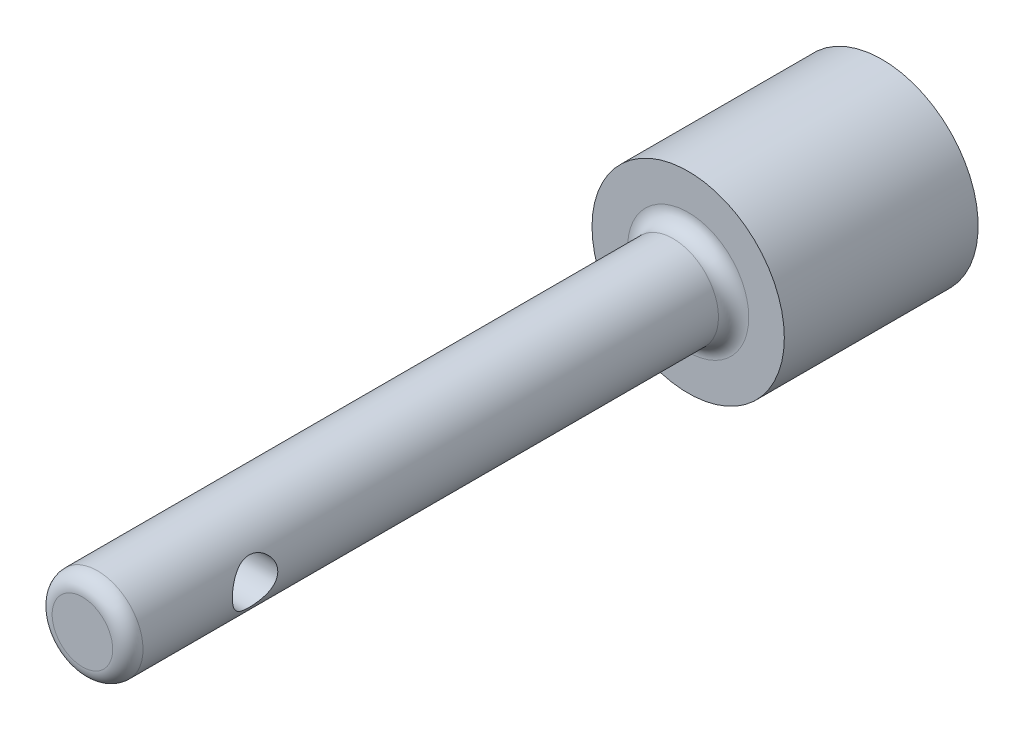
ISO-10303-21;
HEADER;
FILE_DESCRIPTION(('STEP AP214'),'2;1');
FILE_NAME('part.step','',(''),(''),'','','');
FILE_SCHEMA(('AUTOMOTIVE_DESIGN { 1 0 10303 214 1 1 1 1 }'));
ENDSEC;
DATA;
#1=APPLICATION_CONTEXT('core data for automotive mechanical design processes');
#2=APPLICATION_PROTOCOL_DEFINITION('international standard','automotive_design',2000,#1);
#3=PRODUCT_CONTEXT('',#1,'mechanical');
#4=PRODUCT('Part','Part','',(#3));
#5=PRODUCT_RELATED_PRODUCT_CATEGORY('part','',(#4));
#6=PRODUCT_DEFINITION_FORMATION('','',#4);
#7=PRODUCT_DEFINITION_CONTEXT('part definition',#1,'design');
#8=PRODUCT_DEFINITION('design','',#6,#7);
#9=PRODUCT_DEFINITION_SHAPE('','',#8);
#10=(LENGTH_UNIT() NAMED_UNIT(*) SI_UNIT(.MILLI.,.METRE.));
#11=(NAMED_UNIT(*) PLANE_ANGLE_UNIT() SI_UNIT($,.RADIAN.));
#12=(NAMED_UNIT(*) SI_UNIT($,.STERADIAN.) SOLID_ANGLE_UNIT());
#13=UNCERTAINTY_MEASURE_WITH_UNIT(LENGTH_MEASURE(1.E-05),#10,'distance_accuracy_value','');
#14=(GEOMETRIC_REPRESENTATION_CONTEXT(3) GLOBAL_UNCERTAINTY_ASSIGNED_CONTEXT((#13)) GLOBAL_UNIT_ASSIGNED_CONTEXT((#10,
#11,#12)) REPRESENTATION_CONTEXT('',''));
#15=CARTESIAN_POINT('',(0.,0.,0.));
#16=DIRECTION('',(0.,0.,1.));
#17=DIRECTION('',(1.,0.,0.));
#18=AXIS2_PLACEMENT_3D('',#15,#16,#17);
#19=CARTESIAN_POINT('',(0.,0.,11.));
#20=DIRECTION('',(0.,0.,-1.));
#21=DIRECTION('',(-1.,0.,0.));
#22=AXIS2_PLACEMENT_3D('',#19,#20,#21);
#23=CYLINDRICAL_SURFACE('',#22,6.35);
#24=CARTESIAN_POINT('',(-6.35,0.,8.25));
#25=CARTESIAN_POINT('',(-6.34999872344055,0.0694939804326167,8.24999741697149));
#26=CARTESIAN_POINT('',(-6.34884746695947,0.139020856807098,8.24418512233233));
#27=CARTESIAN_POINT('',(-6.34436590183971,0.276110920333323,8.22110707488042));
#28=CARTESIAN_POINT('',(-6.34103383426819,0.343672476376257,8.20383207667014));
#29=CARTESIAN_POINT('',(-6.33256289060586,0.474829848521738,8.1583817049578));
#30=CARTESIAN_POINT('',(-6.32742572017194,0.538429341852969,8.13021661907805));
#31=CARTESIAN_POINT('',(-6.31590367713382,0.65999535360919,8.06381579844673));
#32=CARTESIAN_POINT('',(-6.30951888568045,0.717962238037102,8.02558071863606));
#33=CARTESIAN_POINT('',(-6.29611102614492,0.827384016512085,7.93959245680302));
#34=CARTESIAN_POINT('',(-6.28908132948856,0.878754225040863,7.89173253360937));
#35=CARTESIAN_POINT('',(-6.2752244237706,0.972791329937009,7.78808265203321));
#36=CARTESIAN_POINT('',(-6.26839723022205,1.01545756098707,7.7322920879986));
#37=CARTESIAN_POINT('',(-6.25565368156531,1.09123391279335,7.6137582073905));
#38=CARTESIAN_POINT('',(-6.24974585984846,1.12425674252627,7.55095808890527));
#39=CARTESIAN_POINT('',(-6.23960391049848,1.17924978458522,7.42056529207539));
#40=CARTESIAN_POINT('',(-6.23536962298579,1.2012210527667,7.35297307226771));
#41=CARTESIAN_POINT('',(-6.22912114018685,1.23321317099972,7.21582462774841));
#42=CARTESIAN_POINT('',(-6.22707940916393,1.24338237441818,7.14630428882713));
#43=CARTESIAN_POINT('',(-6.22536429547634,1.25194241392171,7.00651652417689));
#44=CARTESIAN_POINT('',(-6.22569067835976,1.25033441599247,6.93624917309264));
#45=CARTESIAN_POINT('',(-6.22864988383405,1.23550573337242,6.79804466350049));
#46=CARTESIAN_POINT('',(-6.23124899784788,1.22245476039046,6.73008846659444));
#47=CARTESIAN_POINT('',(-6.23840776786276,1.18537832222863,6.59734938288738));
#48=CARTESIAN_POINT('',(-6.24296751484584,1.16135234775691,6.53256664350426));
#49=CARTESIAN_POINT('',(-6.25356844492135,1.10284485747248,6.40752240468413));
#50=CARTESIAN_POINT('',(-6.25961915520019,1.06829575022772,6.34729337201777));
#51=CARTESIAN_POINT('',(-6.27251408593659,0.989770436249237,6.23342386111392));
#52=CARTESIAN_POINT('',(-6.27935839481092,0.945793178637775,6.17978411837918));
#53=CARTESIAN_POINT('',(-6.29321559250291,0.84874962037954,6.07963621686989));
#54=CARTESIAN_POINT('',(-6.30022934156696,0.795538391483492,6.03326849889531));
#55=CARTESIAN_POINT('',(-6.31352591556468,0.682019835627282,5.95009527076996));
#56=CARTESIAN_POINT('',(-6.31980873167657,0.62171242303948,5.91328987602224));
#57=CARTESIAN_POINT('',(-6.33095024356266,0.495559855492551,5.85026145162072));
#58=CARTESIAN_POINT('',(-6.33580682618573,0.429706667639594,5.82405410291237));
#59=CARTESIAN_POINT('',(-6.34353255640573,0.294415437445404,5.78311343800312));
#60=CARTESIAN_POINT('',(-6.3464019370917,0.224977816567585,5.76837877608713));
#61=CARTESIAN_POINT('',(-6.34979761511535,0.0856960204581681,5.75099971472866));
#62=CARTESIAN_POINT('',(-6.35036116751766,0.0158767138616809,5.74816306115027));
#63=CARTESIAN_POINT('',(-6.34918502460119,-0.123238319169054,5.75414330556373));
#64=CARTESIAN_POINT('',(-6.34744545453345,-0.192534073869592,5.76295956983319));
#65=CARTESIAN_POINT('',(-6.34188181040703,-0.328017411524046,5.79183563304381));
#66=CARTESIAN_POINT('',(-6.3380759676032,-0.394226758532905,5.81179713777489));
#67=CARTESIAN_POINT('',(-6.32880490671267,-0.522358707908791,5.86228990537444));
#68=CARTESIAN_POINT('',(-6.32333956723251,-0.584280996267096,5.89282194150836));
#69=CARTESIAN_POINT('',(-6.31126292459246,-0.702894389008584,5.9640074630924));
#70=CARTESIAN_POINT('',(-6.30463875071603,-0.759514422690818,6.00477714131565));
#71=CARTESIAN_POINT('',(-6.29101022941264,-0.865178401164784,6.09512464324686));
#72=CARTESIAN_POINT('',(-6.2840058426409,-0.914221559867102,6.14470337973566));
#73=CARTESIAN_POINT('',(-6.27028126377194,-1.00407868802173,6.2521356229158));
#74=CARTESIAN_POINT('',(-6.26356677403919,-1.04476087118854,6.31010020991976));
#75=CARTESIAN_POINT('',(-6.25130144140895,-1.11581163487925,6.43215321541632));
#76=CARTESIAN_POINT('',(-6.24575055274337,-1.14618062108291,6.49624139290435));
#77=CARTESIAN_POINT('',(-6.23648663322854,-1.19556121034271,6.62840420204532));
#78=CARTESIAN_POINT('',(-6.23276425161642,-1.21463070325767,6.6964565174941));
#79=CARTESIAN_POINT('',(-6.22755858712954,-1.24104736373123,6.83488024343693));
#80=CARTESIAN_POINT('',(-6.2260750225259,-1.24839600622804,6.90525136099793));
#81=CARTESIAN_POINT('',(-6.22553026233713,-1.25110911670658,7.04499277196996));
#82=CARTESIAN_POINT('',(-6.22642699327119,-1.24668173183846,7.11435894429892));
#83=CARTESIAN_POINT('',(-6.23044796366243,-1.22642690288144,7.25133721493432));
#84=CARTESIAN_POINT('',(-6.23357218645326,-1.21059954408838,7.31894932636092));
#85=CARTESIAN_POINT('',(-6.24167758718142,-1.16808561930223,7.45037304713031));
#86=CARTESIAN_POINT('',(-6.24665452942732,-1.14142381041251,7.51419294325068));
#87=CARTESIAN_POINT('',(-6.25790715548942,-1.07802140699671,7.63648638961607));
#88=CARTESIAN_POINT('',(-6.26418294383389,-1.04128000120944,7.6949595090179));
#89=CARTESIAN_POINT('',(-6.27745535581054,-0.958047153780956,7.80593762567599));
#90=CARTESIAN_POINT('',(-6.28446214955247,-0.911405090098396,7.8583284614444));
#91=CARTESIAN_POINT('',(-6.29833330286004,-0.810006714298532,7.95460876853267));
#92=CARTESIAN_POINT('',(-6.30519762933471,-0.755248540568528,7.99849628408175));
#93=CARTESIAN_POINT('',(-6.31809192156363,-0.638509398203908,8.07694085549248));
#94=CARTESIAN_POINT('',(-6.32411277788587,-0.576461177409875,8.11139938409306));
#95=CARTESIAN_POINT('',(-6.33455228311075,-0.447354677582577,8.16934635102892));
#96=CARTESIAN_POINT('',(-6.33897239107068,-0.38030102851324,8.19284478497479));
#97=CARTESIAN_POINT('',(-6.3448426925249,-0.260903753738918,8.22359658768645));
#98=CARTESIAN_POINT('',(-6.34676546742744,-0.209244697378744,8.2334804045104));
#99=CARTESIAN_POINT('',(-6.34934458466464,-0.10506334458243,8.24668298824628));
#100=CARTESIAN_POINT('',(-6.35000096514553,-0.0525410741960241,8.25000195290429));
#101=CARTESIAN_POINT('',(-6.35,0.,8.25));
#102=B_SPLINE_CURVE_WITH_KNOTS('',3,(#24,#25,#26,#27,#28,#29,#30,#31,#32,#33,#34,#35,#36,#37,
#38,#39,#40,#41,#42,#43,#44,#45,#46,#47,#48,#49,#50,#51,#52,#53,#54,#55,#56,#57,#58,#59,#60,#61,
#62,#63,#64,#65,#66,#67,#68,#69,#70,#71,#72,#73,#74,#75,#76,#77,#78,#79,#80,#81,#82,#83,#84,#85,
#86,#87,#88,#89,#90,#91,#92,#93,#94,#95,#96,#97,#98,#99,#100,#101),.UNSPECIFIED.,.T.,.F.,(4,2,2,
2,2,2,2,2,2,2,2,2,2,2,2,2,2,2,2,2,2,2,2,2,2,2,2,2,2,2,2,2,2,2,2,2,2,2,4),(0.,0.208289747189659,
0.416747697814534,0.625009202121001,0.833257164680658,1.04395644558372,1.25467182595345,
1.46723931776153,1.67978649721884,1.88963196168972,2.09945665097821,2.3062210720878,
2.51299508901675,2.7211262980827,2.92928071788109,3.14105959839086,3.35284103463857,
3.56493468769528,3.77700345899184,3.98563198908575,4.19424917376995,4.40105490064573,
4.60787575916645,4.81715935266284,5.02646464445815,5.23885147330543,5.45122994673927,
5.66251073275074,5.87376492933511,6.08131002421398,6.28885356623401,6.49592550697448,
6.70301411889162,6.91351361259454,7.12406146403358,7.33673198768616,7.5492081746515,
7.70669083222362,7.86416874604055),.UNSPECIFIED.);
#103=CARTESIAN_POINT('',(-6.35,0.,8.25));
#104=VERTEX_POINT('',#103);
#105=EDGE_CURVE('E131',#104,#104,#102,.T.);
#106=ORIENTED_EDGE('',*,*,#105,.F.);
#107=EDGE_LOOP('',(#106));
#108=FACE_BOUND('',#107,.T.);
#109=CARTESIAN_POINT('',(0.,0.,13.));
#110=DIRECTION('',(0.,0.,1.));
#111=DIRECTION('',(1.,0.,0.));
#112=AXIS2_PLACEMENT_3D('',#109,#110,#111);
#113=CIRCLE('',#112,6.35);
#114=CARTESIAN_POINT('',(6.35,0.,13.));
#115=VERTEX_POINT('',#114);
#116=EDGE_CURVE('E152',#115,#115,#113,.T.);
#117=ORIENTED_EDGE('',*,*,#116,.F.);
#118=EDGE_LOOP('',(#117));
#119=FACE_BOUND('',#118,.T.);
#120=CARTESIAN_POINT('',(0.,0.,0.2));
#121=DIRECTION('',(0.,0.,-1.));
#122=DIRECTION('',(-1.,0.,0.));
#123=AXIS2_PLACEMENT_3D('',#120,#121,#122);
#124=CIRCLE('',#123,6.35);
#125=CARTESIAN_POINT('',(-6.35,0.,0.2));
#126=VERTEX_POINT('',#125);
#127=EDGE_CURVE('E194',#126,#126,#124,.T.);
#128=ORIENTED_EDGE('',*,*,#127,.F.);
#129=EDGE_LOOP('',(#128));
#130=FACE_BOUND('',#129,.T.);
#131=ADVANCED_FACE('F59',(#108,#119,#130),#23,.T.);
#132=CARTESIAN_POINT('',(0.,0.,11.));
#133=DIRECTION('',(0.,0.,-1.));
#134=DIRECTION('',(-1.,0.,0.));
#135=AXIS2_PLACEMENT_3D('',#132,#133,#134);
#136=CYLINDRICAL_SURFACE('',#135,3.);
#137=CARTESIAN_POINT('',(-3.,0.,8.25));
#138=CARTESIAN_POINT('',(-2.99999458367273,0.0669580526362668,8.2499927949087));
#139=CARTESIAN_POINT('',(-2.9977323297471,0.134021397063841,8.24458804147186));
#140=CARTESIAN_POINT('',(-2.98890153579552,0.266247371156347,8.22316093507982));
#141=CARTESIAN_POINT('',(-2.98232175901028,0.331404576423564,8.20711087553575));
#142=CARTESIAN_POINT('',(-2.96556289038127,0.457688733653088,8.16508890821941));
#143=CARTESIAN_POINT('',(-2.95539599975004,0.518828524426269,8.13915061053185));
#144=CARTESIAN_POINT('',(-2.93245286470664,0.635829756679802,8.07822717676743));
#145=CARTESIAN_POINT('',(-2.91967741092849,0.691692790015939,8.04324478102913));
#146=CARTESIAN_POINT('',(-2.89207828351869,0.799448403559512,7.96337101740912));
#147=CARTESIAN_POINT('',(-2.87718753326093,0.851041267517768,7.91809869121025));
#148=CARTESIAN_POINT('',(-2.84732714068514,0.946159821091262,7.81973566521743));
#149=CARTESIAN_POINT('',(-2.83235746106809,0.989681263153085,7.76664087510549));
#150=CARTESIAN_POINT('',(-2.80321021812995,1.06953737697065,7.6509732224351));
#151=CARTESIAN_POINT('',(-2.78910786873385,1.10541308153925,7.58806255157346));
#152=CARTESIAN_POINT('',(-2.76435572357005,1.16593940588866,7.45642674207907));
#153=CARTESIAN_POINT('',(-2.75370415000823,1.19059580836291,7.38770462051555));
#154=CARTESIAN_POINT('',(-2.73778555387705,1.22674598312159,7.24984630823208));
#155=CARTESIAN_POINT('',(-2.73228387651787,1.23881657877605,7.18088951660784));
#156=CARTESIAN_POINT('',(-2.72661326219504,1.25125209967796,7.04172670731343));
#157=CARTESIAN_POINT('',(-2.7264413842526,1.25162348054397,6.97152139997426));
#158=CARTESIAN_POINT('',(-2.73125119560853,1.24108450363674,6.83759993956506));
#159=CARTESIAN_POINT('',(-2.73583882723623,1.23103681112301,6.77379890343554));
#160=CARTESIAN_POINT('',(-2.74898482773796,1.20139191015777,6.64888790899961));
#161=CARTESIAN_POINT('',(-2.75754395703564,1.18179287287177,6.58777846850823));
#162=CARTESIAN_POINT('',(-2.77786184772756,1.13321958727571,6.46844229700856));
#163=CARTESIAN_POINT('',(-2.78968481949136,1.10405471539236,6.41030457908662));
#164=CARTESIAN_POINT('',(-2.81518331141086,1.03731242580562,6.29952226611985));
#165=CARTESIAN_POINT('',(-2.8288595612978,0.999731690519543,6.24687984938648));
#166=CARTESIAN_POINT('',(-2.85792976877979,0.913495965543834,6.14390004126716));
#167=CARTESIAN_POINT('',(-2.87337121404473,0.864173483207525,6.09413343261456));
#168=CARTESIAN_POINT('',(-2.90325673112529,0.757729591051511,6.00338649704082));
#169=CARTESIAN_POINT('',(-2.9177005687701,0.700606359448455,5.96240822830782));
#170=CARTESIAN_POINT('',(-2.94438283556473,0.578447948693375,5.88956417638373));
#171=CARTESIAN_POINT('',(-2.95656266543334,0.513260582447679,5.85793055484932));
#172=CARTESIAN_POINT('',(-2.97689481414803,0.37785240252683,5.80627886039674));
#173=CARTESIAN_POINT('',(-2.985049358458,0.307634394795034,5.78625436805618));
#174=CARTESIAN_POINT('',(-2.99599641186385,0.168928113346227,5.75958400787336));
#175=CARTESIAN_POINT('',(-2.99909541047125,0.100611285278638,5.75217214255625));
#176=CARTESIAN_POINT('',(-3.00056050368745,-0.0363546554960902,5.74865377638591));
#177=CARTESIAN_POINT('',(-2.99892795711939,-0.105003667152637,5.752544029748));
#178=CARTESIAN_POINT('',(-2.9913121765694,-0.237098242341436,5.77097108480607));
#179=CARTESIAN_POINT('',(-2.9855488728399,-0.300632966639387,5.7849699540972));
#180=CARTESIAN_POINT('',(-2.97048606772414,-0.424382748971092,5.82246819454078));
#181=CARTESIAN_POINT('',(-2.96118611959704,-0.484597386518362,5.8459687659503));
#182=CARTESIAN_POINT('',(-2.93958270645166,-0.602108999869138,5.90257097571212));
#183=CARTESIAN_POINT('',(-2.92719491469281,-0.659257236855326,5.93594818314603));
#184=CARTESIAN_POINT('',(-2.9007380457909,-0.767346216231431,6.01105337779169));
#185=CARTESIAN_POINT('',(-2.88666826768733,-0.818284352601943,6.05278485152927));
#186=CARTESIAN_POINT('',(-2.85712087895438,-0.916333430274265,6.14690323327241));
#187=CARTESIAN_POINT('',(-2.84161451591029,-0.962910697979836,6.19983850298626));
#188=CARTESIAN_POINT('',(-2.81184336768005,-1.04666984610551,6.31302127593539));
#189=CARTESIAN_POINT('',(-2.79757886493438,-1.08384959285618,6.37327043517173));
#190=CARTESIAN_POINT('',(-2.77181386243988,-1.14815960208699,6.50061417530258));
#191=CARTESIAN_POINT('',(-2.76035562555111,-1.17513918237329,6.56779403551483));
#192=CARTESIAN_POINT('',(-2.74208355658957,-1.21717413951573,6.70637059381011));
#193=CARTESIAN_POINT('',(-2.73526589555752,-1.23223934863688,6.77776376248335));
#194=CARTESIAN_POINT('',(-2.72763164537264,-1.24904080348901,6.91681869919921));
#195=CARTESIAN_POINT('',(-2.72639350967163,-1.25171380413129,6.98434466229262));
#196=CARTESIAN_POINT('',(-2.72893853011024,-1.24615575523912,7.1188428611411));
#197=CARTESIAN_POINT('',(-2.73272091540306,-1.23792637964722,7.18581518031369));
#198=CARTESIAN_POINT('',(-2.74449551302268,-1.21158404780491,7.31409274746889));
#199=CARTESIAN_POINT('',(-2.7522835484648,-1.19394903571466,7.37551667346339));
#200=CARTESIAN_POINT('',(-2.77103181199189,-1.14976328202135,7.49454802135723));
#201=CARTESIAN_POINT('',(-2.78199293131693,-1.12321003517252,7.55215436539878));
#202=CARTESIAN_POINT('',(-2.80666954560013,-1.0601028593549,7.66569589594912));
#203=CARTESIAN_POINT('',(-2.82051102713679,-1.02304360910483,7.72132233016829));
#204=CARTESIAN_POINT('',(-2.84903689053839,-0.940684072630392,7.82586013936068));
#205=CARTESIAN_POINT('',(-2.86372156345875,-0.895380928905619,7.87476917560057));
#206=CARTESIAN_POINT('',(-2.89356392850106,-0.793902045778822,7.96814868168474));
#207=CARTESIAN_POINT('',(-2.90867817511792,-0.737174739949029,8.01203643284065));
#208=CARTESIAN_POINT('',(-2.9366014362202,-0.6166000792532,8.08969945354363));
#209=CARTESIAN_POINT('',(-2.9494093991674,-0.552749497945746,8.12347011488955));
#210=CARTESIAN_POINT('',(-2.97109183362461,-0.42073205671795,8.17920984543988));
#211=CARTESIAN_POINT('',(-2.98002782581964,-0.352653990980635,8.2013647666173));
#212=CARTESIAN_POINT('',(-2.99321009768625,-0.213410421846559,8.23370632907783));
#213=CARTESIAN_POINT('',(-2.99747105811967,-0.142255316980957,8.24393044252988));
#214=CARTESIAN_POINT('',(-2.99972287568934,-0.0472360819191831,8.24933316108645));
#215=CARTESIAN_POINT('',(-3.00000191102536,-0.023624594675657,8.25000254214922));
#216=CARTESIAN_POINT('',(-3.,0.,8.25));
#217=B_SPLINE_CURVE_WITH_KNOTS('',3,(#137,#138,#139,#140,#141,#142,#143,#144,#145,#146,#147,
#148,#149,#150,#151,#152,#153,#154,#155,#156,#157,#158,#159,#160,#161,#162,#163,#164,#165,#166,
#167,#168,#169,#170,#171,#172,#173,#174,#175,#176,#177,#178,#179,#180,#181,#182,#183,#184,#185,
#186,#187,#188,#189,#190,#191,#192,#193,#194,#195,#196,#197,#198,#199,#200,#201,#202,#203,#204,
#205,#206,#207,#208,#209,#210,#211,#212,#213,#214,#215,#216),.UNSPECIFIED.,.T.,.F.,(4,2,2,2,2,2,
2,2,2,2,2,2,2,2,2,2,2,2,2,2,2,2,2,2,2,2,2,2,2,2,2,2,2,2,2,2,2,2,2,4),(0.,0.200806918883939,
0.402138540628697,0.602791851906301,0.803384436852974,1.01317936288807,1.22308438131465,
1.44331724539125,1.66343646730588,1.87295273137558,2.08235338249046,2.27570157202556,
2.46908679727213,2.66658713058715,2.86416545717207,3.07844141127897,3.29276749314588,
3.51204055060813,3.73119224218297,3.93648443393251,4.14171767493172,4.33676589735721,
4.53183876601785,4.73297135272161,4.93418805469496,5.14978488029294,5.36543061240341,
5.58414788359524,5.80268447074581,6.00439877559644,6.20608211297536,6.39837649964762,
6.59072494950613,6.79463893397441,6.99862373425944,7.21746535004889,7.43640649428582,
7.65172855819385,7.86637250469321,7.93722256499098),.UNSPECIFIED.);
#218=CARTESIAN_POINT('',(-3.,0.,8.25));
#219=VERTEX_POINT('',#218);
#220=EDGE_CURVE('E124',#219,#219,#217,.T.);
#221=ORIENTED_EDGE('',*,*,#220,.T.);
#222=EDGE_LOOP('',(#221));
#223=FACE_BOUND('',#222,.T.);
#224=CARTESIAN_POINT('',(0.,0.,11.));
#225=DIRECTION('',(0.,0.,1.));
#226=DIRECTION('',(1.,0.,0.));
#227=AXIS2_PLACEMENT_3D('',#224,#225,#226);
#228=CIRCLE('',#227,3.);
#229=CARTESIAN_POINT('',(3.,0.,11.));
#230=VERTEX_POINT('',#229);
#231=EDGE_CURVE('E157',#230,#230,#228,.T.);
#232=ORIENTED_EDGE('',*,*,#231,.T.);
#233=EDGE_LOOP('',(#232));
#234=FACE_BOUND('',#233,.T.);
#235=CARTESIAN_POINT('',(3.,0.,8.25));
#236=CARTESIAN_POINT('',(2.99999458367273,-0.0669580526362677,8.2499927949087));
#237=CARTESIAN_POINT('',(2.9977323297471,-0.134021397063842,8.24458804147186));
#238=CARTESIAN_POINT('',(2.98890153579552,-0.266247371156348,8.22316093507982));
#239=CARTESIAN_POINT('',(2.98232175901028,-0.331404576423565,8.20711087553575));
#240=CARTESIAN_POINT('',(2.96556289038127,-0.457688733653089,8.16508890821941));
#241=CARTESIAN_POINT('',(2.95539599975004,-0.51882852442627,8.13915061053185));
#242=CARTESIAN_POINT('',(2.93245286470664,-0.635829756679803,8.07822717676743));
#243=CARTESIAN_POINT('',(2.91967741092849,-0.691692790015941,8.04324478102913));
#244=CARTESIAN_POINT('',(2.89207828351869,-0.799448403559513,7.96337101740912));
#245=CARTESIAN_POINT('',(2.87718753326093,-0.85104126751777,7.91809869121025));
#246=CARTESIAN_POINT('',(2.84732714068513,-0.946159821091264,7.81973566521743));
#247=CARTESIAN_POINT('',(2.83235746106809,-0.989681263153087,7.76664087510549));
#248=CARTESIAN_POINT('',(2.80321021812995,-1.06953737697066,7.6509732224351));
#249=CARTESIAN_POINT('',(2.78910786873385,-1.10541308153925,7.58806255157345));
#250=CARTESIAN_POINT('',(2.76435572357005,-1.16593940588866,7.45642674207907));
#251=CARTESIAN_POINT('',(2.75370415000823,-1.19059580836291,7.38770462051555));
#252=CARTESIAN_POINT('',(2.73778555387705,-1.22674598312159,7.24984630823208));
#253=CARTESIAN_POINT('',(2.73228387651787,-1.23881657877606,7.18088951660784));
#254=CARTESIAN_POINT('',(2.72661326219504,-1.25125209967796,7.04172670731343));
#255=CARTESIAN_POINT('',(2.7264413842526,-1.25162348054397,6.97152139997426));
#256=CARTESIAN_POINT('',(2.73125119560853,-1.24108450363674,6.83759993956506));
#257=CARTESIAN_POINT('',(2.73583882723623,-1.23103681112301,6.77379890343554));
#258=CARTESIAN_POINT('',(2.74898482773796,-1.20139191015777,6.64888790899961));
#259=CARTESIAN_POINT('',(2.75754395703564,-1.18179287287177,6.58777846850823));
#260=CARTESIAN_POINT('',(2.77786184772756,-1.13321958727571,6.46844229700856));
#261=CARTESIAN_POINT('',(2.78968481949136,-1.10405471539236,6.41030457908662));
#262=CARTESIAN_POINT('',(2.81518331141086,-1.03731242580562,6.29952226611985));
#263=CARTESIAN_POINT('',(2.82885956129779,-0.999731690519545,6.24687984938648));
#264=CARTESIAN_POINT('',(2.85792976877979,-0.913495965543836,6.14390004126716));
#265=CARTESIAN_POINT('',(2.87337121404473,-0.864173483207528,6.09413343261456));
#266=CARTESIAN_POINT('',(2.90325673112529,-0.757729591051513,6.00338649704082));
#267=CARTESIAN_POINT('',(2.9177005687701,-0.700606359448458,5.96240822830782));
#268=CARTESIAN_POINT('',(2.94438283556473,-0.578447948693377,5.88956417638373));
#269=CARTESIAN_POINT('',(2.95656266543334,-0.513260582447681,5.85793055484932));
#270=CARTESIAN_POINT('',(2.97689481414803,-0.377852402526833,5.80627886039674));
#271=CARTESIAN_POINT('',(2.985049358458,-0.307634394795036,5.78625436805618));
#272=CARTESIAN_POINT('',(2.99599641186385,-0.168928113346229,5.75958400787336));
#273=CARTESIAN_POINT('',(2.99909541047125,-0.10061128527864,5.75217214255625));
#274=CARTESIAN_POINT('',(3.00056050368745,0.036354655496088,5.74865377638591));
#275=CARTESIAN_POINT('',(2.99892795711939,0.105003667152634,5.752544029748));
#276=CARTESIAN_POINT('',(2.9913121765694,0.237098242341434,5.77097108480607));
#277=CARTESIAN_POINT('',(2.9855488728399,0.300632966639386,5.7849699540972));
#278=CARTESIAN_POINT('',(2.97048606772414,0.42438274897109,5.82246819454078));
#279=CARTESIAN_POINT('',(2.96118611959704,0.48459738651836,5.8459687659503));
#280=CARTESIAN_POINT('',(2.93958270645166,0.602108999869136,5.90257097571212));
#281=CARTESIAN_POINT('',(2.92719491469281,0.659257236855323,5.93594818314603));
#282=CARTESIAN_POINT('',(2.9007380457909,0.767346216231429,6.01105337779169));
#283=CARTESIAN_POINT('',(2.88666826768733,0.81828435260194,6.05278485152927));
#284=CARTESIAN_POINT('',(2.85712087895438,0.916333430274263,6.14690323327241));
#285=CARTESIAN_POINT('',(2.84161451591029,0.962910697979835,6.19983850298626));
#286=CARTESIAN_POINT('',(2.81184336768005,1.04666984610551,6.31302127593539));
#287=CARTESIAN_POINT('',(2.79757886493439,1.08384959285617,6.37327043517173));
#288=CARTESIAN_POINT('',(2.77181386243988,1.14815960208699,6.50061417530258));
#289=CARTESIAN_POINT('',(2.76035562555112,1.17513918237329,6.56779403551483));
#290=CARTESIAN_POINT('',(2.74208355658957,1.21717413951573,6.7063705938101));
#291=CARTESIAN_POINT('',(2.73526589555752,1.23223934863687,6.77776376248335));
#292=CARTESIAN_POINT('',(2.72763164537264,1.24904080348901,6.91681869919921));
#293=CARTESIAN_POINT('',(2.72639350967163,1.25171380413129,6.98434466229261));
#294=CARTESIAN_POINT('',(2.72893853011024,1.24615575523912,7.1188428611411));
#295=CARTESIAN_POINT('',(2.73272091540306,1.23792637964721,7.18581518031369));
#296=CARTESIAN_POINT('',(2.74449551302268,1.21158404780491,7.31409274746889));
#297=CARTESIAN_POINT('',(2.7522835484648,1.19394903571466,7.37551667346339));
#298=CARTESIAN_POINT('',(2.77103181199189,1.14976328202134,7.49454802135723));
#299=CARTESIAN_POINT('',(2.78199293131693,1.12321003517252,7.55215436539878));
#300=CARTESIAN_POINT('',(2.80666954560013,1.06010285935489,7.66569589594912));
#301=CARTESIAN_POINT('',(2.82051102713679,1.02304360910483,7.72132233016829));
#302=CARTESIAN_POINT('',(2.84903689053839,0.94068407263039,7.82586013936068));
#303=CARTESIAN_POINT('',(2.86372156345875,0.895380928905618,7.87476917560057));
#304=CARTESIAN_POINT('',(2.89356392850106,0.79390204577882,7.96814868168474));
#305=CARTESIAN_POINT('',(2.90867817511792,0.737174739949027,8.01203643284065));
#306=CARTESIAN_POINT('',(2.9366014362202,0.616600079253198,8.08969945354363));
#307=CARTESIAN_POINT('',(2.9494093991674,0.552749497945745,8.12347011488955));
#308=CARTESIAN_POINT('',(2.97109183362461,0.420732056717949,8.17920984543988));
#309=CARTESIAN_POINT('',(2.98002782581964,0.352653990980635,8.2013647666173));
#310=CARTESIAN_POINT('',(2.99321009768625,0.213410421846558,8.23370632907783));
#311=CARTESIAN_POINT('',(2.99747105811967,0.142255316980957,8.24393044252988));
#312=CARTESIAN_POINT('',(2.99972287568934,0.0472360819191829,8.24933316108645));
#313=CARTESIAN_POINT('',(3.00000191102536,0.0236245946756564,8.25000254214922));
#314=CARTESIAN_POINT('',(3.,0.,8.25));
#315=B_SPLINE_CURVE_WITH_KNOTS('',3,(#235,#236,#237,#238,#239,#240,#241,#242,#243,#244,#245,
#246,#247,#248,#249,#250,#251,#252,#253,#254,#255,#256,#257,#258,#259,#260,#261,#262,#263,#264,
#265,#266,#267,#268,#269,#270,#271,#272,#273,#274,#275,#276,#277,#278,#279,#280,#281,#282,#283,
#284,#285,#286,#287,#288,#289,#290,#291,#292,#293,#294,#295,#296,#297,#298,#299,#300,#301,#302,
#303,#304,#305,#306,#307,#308,#309,#310,#311,#312,#313,#314),.UNSPECIFIED.,.T.,.F.,(4,2,2,2,2,2,
2,2,2,2,2,2,2,2,2,2,2,2,2,2,2,2,2,2,2,2,2,2,2,2,2,2,2,2,2,2,2,2,2,4),(0.,0.200806918883939,
0.402138540628697,0.602791851906301,0.803384436852975,1.01317936288807,1.22308438131466,
1.44331724539125,1.66343646730588,1.87295273137558,2.08235338249046,2.27570157202557,
2.46908679727213,2.66658713058714,2.86416545717207,3.07844141127897,3.29276749314588,
3.51204055060813,3.73119224218297,3.93648443393251,4.14171767493172,4.33676589735721,
4.53183876601785,4.73297135272161,4.93418805469496,5.14978488029294,5.36543061240341,
5.58414788359524,5.80268447074581,6.00439877559644,6.20608211297537,6.39837649964763,
6.59072494950613,6.79463893397441,6.99862373425944,7.21746535004889,7.43640649428583,
7.65172855819386,7.86637250469321,7.93722256499098),.UNSPECIFIED.);
#316=CARTESIAN_POINT('',(3.,0.,8.25));
#317=VERTEX_POINT('',#316);
#318=EDGE_CURVE('E116',#317,#317,#315,.T.);
#319=ORIENTED_EDGE('',*,*,#318,.T.);
#320=EDGE_LOOP('',(#319));
#321=FACE_BOUND('',#320,.T.);
#322=CARTESIAN_POINT('',(0.,0.,0.200000000000001));
#323=DIRECTION('',(0.,0.,-1.));
#324=DIRECTION('',(-1.,0.,0.));
#325=AXIS2_PLACEMENT_3D('',#322,#323,#324);
#326=CIRCLE('',#325,3.);
#327=CARTESIAN_POINT('',(-3.,0.,0.200000000000001));
#328=VERTEX_POINT('',#327);
#329=EDGE_CURVE('E63',#328,#328,#326,.T.);
#330=ORIENTED_EDGE('',*,*,#329,.T.);
#331=EDGE_LOOP('',(#330));
#332=FACE_BOUND('',#331,.T.);
#333=ADVANCED_FACE('F133',(#223,#234,#321,#332),#136,.F.);
#334=CARTESIAN_POINT('',(0.,0.,11.));
#335=DIRECTION('',(0.,0.,1.));
#336=DIRECTION('',(1.,0.,0.));
#337=AXIS2_PLACEMENT_3D('',#334,#335,#336);
#338=PLANE('',#337);
#339=ORIENTED_EDGE('',*,*,#231,.F.);
#340=EDGE_LOOP('',(#339));
#341=FACE_BOUND('',#340,.T.);
#342=ADVANCED_FACE('F138',(#341),#338,.F.);
#343=CARTESIAN_POINT('',(0.,0.,13.));
#344=DIRECTION('',(0.,0.,1.));
#345=DIRECTION('',(1.,0.,0.));
#346=AXIS2_PLACEMENT_3D('',#343,#344,#345);
#347=PLANE('',#346);
#348=CARTESIAN_POINT('',(0.,0.,13.));
#349=DIRECTION('',(0.,0.,1.));
#350=DIRECTION('',(1.,0.,0.));
#351=AXIS2_PLACEMENT_3D('',#348,#349,#350);
#352=CIRCLE('',#351,4.);
#353=CARTESIAN_POINT('',(4.,0.,13.));
#354=VERTEX_POINT('',#353);
#355=EDGE_CURVE('E75',#354,#354,#352,.F.);
#356=ORIENTED_EDGE('',*,*,#355,.T.);
#357=EDGE_LOOP('',(#356));
#358=FACE_BOUND('',#357,.T.);
#359=ORIENTED_EDGE('',*,*,#116,.T.);
#360=EDGE_LOOP('',(#359));
#361=FACE_BOUND('',#360,.T.);
#362=ADVANCED_FACE('F173',(#358,#361),#347,.T.);
#363=CARTESIAN_POINT('',(0.,0.,53.));
#364=DIRECTION('',(0.,0.,-1.));
#365=DIRECTION('',(-1.,0.,0.));
#366=AXIS2_PLACEMENT_3D('',#363,#364,#365);
#367=CYLINDRICAL_SURFACE('',#366,3.);
#368=CARTESIAN_POINT('',(-3.,0.,46.1));
#369=CARTESIAN_POINT('',(-2.99999570107562,-0.0788579444268505,46.0999950465242));
#370=CARTESIAN_POINT('',(-2.99685736529635,-0.157809899546344,46.0937448903184));
#371=CARTESIAN_POINT('',(-2.98461234055736,-0.313380352903345,46.0690206794877));
#372=CARTESIAN_POINT('',(-2.97549431743379,-0.389994130070445,46.0505234105033));
#373=CARTESIAN_POINT('',(-2.95224419105063,-0.538400317320674,46.0022092870751));
#374=CARTESIAN_POINT('',(-2.93813158766306,-0.610210204408719,45.9724364236281));
#375=CARTESIAN_POINT('',(-2.90618664773642,-0.747708925209898,45.9026440679525));
#376=CARTESIAN_POINT('',(-2.88835460450288,-0.81339824098509,45.8626253836267));
#377=CARTESIAN_POINT('',(-2.84934387387093,-0.941261726642864,45.7707241257721));
#378=CARTESIAN_POINT('',(-2.82802798691306,-1.00298281668316,45.7182702811405));
#379=CARTESIAN_POINT('',(-2.78489955370115,-1.11716916730047,45.6042177811294));
#380=CARTESIAN_POINT('',(-2.76308664313552,-1.16962737466015,45.5426122223413));
#381=CARTESIAN_POINT('',(-2.71948426796021,-1.26787800067542,45.4062749757149));
#382=CARTESIAN_POINT('',(-2.69782780455198,-1.31283800332746,45.3308958524811));
#383=CARTESIAN_POINT('',(-2.65928968158481,-1.38925234033605,45.1724489960207));
#384=CARTESIAN_POINT('',(-2.64240461410484,-1.4207163224495,45.0893868069159));
#385=CARTESIAN_POINT('',(-2.61686800556713,-1.46719866328289,44.9230023418671));
#386=CARTESIAN_POINT('',(-2.6077840737557,-1.48308878562067,44.8399933218989));
#387=CARTESIAN_POINT('',(-2.59772834922791,-1.50064048996327,44.6720317433308));
#388=CARTESIAN_POINT('',(-2.59674854014932,-1.50231613255961,44.5870811886933));
#389=CARTESIAN_POINT('',(-2.60266395385873,-1.49203093075845,44.428570963527));
#390=CARTESIAN_POINT('',(-2.6086314549302,-1.48167683930524,44.3548639531654));
#391=CARTESIAN_POINT('',(-2.62614343100775,-1.4504097735854,44.2104171359404));
#392=CARTESIAN_POINT('',(-2.63768968247664,-1.42949343584648,44.139678282042));
#393=CARTESIAN_POINT('',(-2.66531214619111,-1.37731467057901,44.0011563011515));
#394=CARTESIAN_POINT('',(-2.68148760995998,-1.345822600674,43.9334804018213));
#395=CARTESIAN_POINT('',(-2.71655106422105,-1.27356253150201,43.804048561115));
#396=CARTESIAN_POINT('',(-2.73544027170286,-1.23279036571871,43.7422952965999));
#397=CARTESIAN_POINT('',(-2.77669736854929,-1.13709908236919,43.6182181208852));
#398=CARTESIAN_POINT('',(-2.79920265355119,-1.08104168755392,43.5568146896358));
#399=CARTESIAN_POINT('',(-2.84321434950611,-0.959333368112061,43.4438968721136));
#400=CARTESIAN_POINT('',(-2.86472027938201,-0.893677884861429,43.3923872119492));
#401=CARTESIAN_POINT('',(-2.90552980924446,-0.750774758747772,43.2984715084554));
#402=CARTESIAN_POINT('',(-2.92468476243011,-0.673130387399111,43.2565992913314));
#403=CARTESIAN_POINT('',(-2.95736821681863,-0.510699323233194,43.1868544564355));
#404=CARTESIAN_POINT('',(-2.9709011841533,-0.425918364397914,43.1589707224772));
#405=CARTESIAN_POINT('',(-2.98986500612153,-0.259149737491055,43.120286894425));
#406=CARTESIAN_POINT('',(-2.99587407451965,-0.177512295822491,43.1082631463798));
#407=CARTESIAN_POINT('',(-3.00109520188655,-0.0131693999240304,43.0978029032983));
#408=CARTESIAN_POINT('',(-3.00031048081978,0.0695355298048595,43.0993599715408));
#409=CARTESIAN_POINT('',(-2.99236788380152,0.226849457978976,43.1153100326281));
#410=CARTESIAN_POINT('',(-2.98570868532253,0.30158911207489,43.128698799095));
#411=CARTESIAN_POINT('',(-2.9673325697226,0.447610338452908,43.1663571078427));
#412=CARTESIAN_POINT('',(-2.95561509501618,0.518891528536628,43.1906278496802));
#413=CARTESIAN_POINT('',(-2.92776377120382,0.658332912674358,43.2499976996495));
#414=CARTESIAN_POINT('',(-2.91151322654446,0.726345595508704,43.2853865751744));
#415=CARTESIAN_POINT('',(-2.87615961476126,0.855692042548907,43.3656613034698));
#416=CARTESIAN_POINT('',(-2.85705533350407,0.917022944664888,43.4105512018931));
#417=CARTESIAN_POINT('',(-2.81562332004297,1.03765153393382,43.5136406379961));
#418=CARTESIAN_POINT('',(-2.79316327265249,1.09615811672854,43.5727143026677));
#419=CARTESIAN_POINT('',(-2.7489358741323,1.20278448167828,43.6998877269166));
#420=CARTESIAN_POINT('',(-2.72716901100071,1.25089707856781,43.7679936782719));
#421=CARTESIAN_POINT('',(-2.68576788309734,1.33756187171853,43.9154654812595));
#422=CARTESIAN_POINT('',(-2.66628794383591,1.37553824370037,43.9952168991417));
#423=CARTESIAN_POINT('',(-2.63361108441202,1.43712423890206,44.1612651013624));
#424=CARTESIAN_POINT('',(-2.62040607332625,1.46075237380053,44.2475532897003));
#425=CARTESIAN_POINT('',(-2.60342251538703,1.49079253120031,44.415365334327));
#426=CARTESIAN_POINT('',(-2.59886075197597,1.49863949460818,44.4965513801529));
#427=CARTESIAN_POINT('',(-2.59748031962405,1.50103373156431,44.6591706007468));
#428=CARTESIAN_POINT('',(-2.60065829439585,1.49558676993487,44.7406036531068));
#429=CARTESIAN_POINT('',(-2.61356793076615,1.47288918838997,44.8932252523001));
#430=CARTESIAN_POINT('',(-2.62264641723987,1.45681247151456,44.9646507052171));
#431=CARTESIAN_POINT('',(-2.64556524281479,1.41476303733662,45.1037121791365));
#432=CARTESIAN_POINT('',(-2.65940711354502,1.38878713673989,45.171346973138));
#433=CARTESIAN_POINT('',(-2.69142795546803,1.32572361795085,45.3059372764798));
#434=CARTESIAN_POINT('',(-2.70983583593881,1.28800670672356,45.3725418527435));
#435=CARTESIAN_POINT('',(-2.7485299745229,1.2032264574561,45.4989118042719));
#436=CARTESIAN_POINT('',(-2.76881720693416,1.15615825686235,45.5586735957817));
#437=CARTESIAN_POINT('',(-2.81193484737138,1.04730498999207,45.677212973532));
#438=CARTESIAN_POINT('',(-2.83477474959942,0.9844266344959,45.7349886535254));
#439=CARTESIAN_POINT('',(-2.87816628389896,0.849232209349804,45.8393944751529));
#440=CARTESIAN_POINT('',(-2.89871667939292,0.776911084957805,45.8860186092049));
#441=CARTESIAN_POINT('',(-2.93547014349806,0.623897395174428,45.9668545440681));
#442=CARTESIAN_POINT('',(-2.95164144740899,0.543149255665105,46.0009762538547));
#443=CARTESIAN_POINT('',(-2.9775201194848,0.376113151707138,46.0547122516361));
#444=CARTESIAN_POINT('',(-2.98724585044602,0.289841699383657,46.0743677702086));
#445=CARTESIAN_POINT('',(-2.99543192870217,0.168902919736349,46.0908461166286));
#446=CARTESIAN_POINT('',(-2.99714048010376,0.135242819162353,46.0942739612995));
#447=CARTESIAN_POINT('',(-2.99942545465223,0.0677275977076406,46.0988519982711));
#448=CARTESIAN_POINT('',(-3.00000184655071,0.0338724714699443,46.1000021277053));
#449=CARTESIAN_POINT('',(-3.,0.,46.1));
#450=B_SPLINE_CURVE_WITH_KNOTS('',3,(#368,#369,#370,#371,#372,#373,#374,#375,#376,#377,#378,
#379,#380,#381,#382,#383,#384,#385,#386,#387,#388,#389,#390,#391,#392,#393,#394,#395,#396,#397,
#398,#399,#400,#401,#402,#403,#404,#405,#406,#407,#408,#409,#410,#411,#412,#413,#414,#415,#416,
#417,#418,#419,#420,#421,#422,#423,#424,#425,#426,#427,#428,#429,#430,#431,#432,#433,#434,#435,
#436,#437,#438,#439,#440,#441,#442,#443,#444,#445,#446,#447,#448,#449),.UNSPECIFIED.,.T.,.F.,(4,
2,2,2,2,2,2,2,2,2,2,2,2,2,2,2,2,2,2,2,2,2,2,2,2,2,2,2,2,2,2,2,2,2,2,2,2,2,2,2,4),(0.,
0.236436386130439,0.473322224563797,0.709293233238445,0.945245640872351,1.19547263807713,
1.44588935648105,1.71572589646129,1.98536921847422,2.23887018210346,2.49212035993531,
2.71508568613981,2.93812205888519,3.16635360252732,3.39468781890334,3.65197412000819,
3.90938301898031,4.17874533321662,4.44789325368421,4.6947493570702,4.94148846767215,
5.16910359759184,5.39674382446399,5.63089284041849,5.8651417612251,6.12239415966629,
6.3798238292315,6.6497202324259,6.91926767918178,7.16293961254571,7.40650589797019,
7.62686895373285,7.84730293182529,8.08254685170433,8.31791341715448,8.58187864135759,
8.8459857507187,9.11196020495292,9.37717362931726,9.47872920200877,9.58028757766602),.UNSPECIFIED.);
#451=CARTESIAN_POINT('',(-3.,0.,46.1));
#452=VERTEX_POINT('',#451);
#453=EDGE_CURVE('E87',#452,#452,#450,.T.);
#454=ORIENTED_EDGE('',*,*,#453,.T.);
#455=EDGE_LOOP('',(#454));
#456=FACE_BOUND('',#455,.T.);
#457=CARTESIAN_POINT('',(3.,0.,43.1));
#458=CARTESIAN_POINT('',(2.99999570107562,-0.0788579444268505,43.1000049534758));
#459=CARTESIAN_POINT('',(2.99685736529635,-0.157809899546344,43.1062551096816));
#460=CARTESIAN_POINT('',(2.98461234055736,-0.313380352903345,43.1309793205123));
#461=CARTESIAN_POINT('',(2.97549431743379,-0.389994130070445,43.1494765894967));
#462=CARTESIAN_POINT('',(2.95224419105063,-0.538400317320674,43.1977907129249));
#463=CARTESIAN_POINT('',(2.93813158766306,-0.610210204408719,43.2275635763719));
#464=CARTESIAN_POINT('',(2.90618664773642,-0.747708925209898,43.2973559320475));
#465=CARTESIAN_POINT('',(2.88835460450288,-0.81339824098509,43.3373746163733));
#466=CARTESIAN_POINT('',(2.84934387387093,-0.941261726642864,43.4292758742279));
#467=CARTESIAN_POINT('',(2.82802798691306,-1.00298281668316,43.4817297188595));
#468=CARTESIAN_POINT('',(2.78489955370115,-1.11716916730047,43.5957822188706));
#469=CARTESIAN_POINT('',(2.76308664313552,-1.16962737466015,43.6573877776587));
#470=CARTESIAN_POINT('',(2.71948426796021,-1.26787800067542,43.7937250242851));
#471=CARTESIAN_POINT('',(2.69782780455198,-1.31283800332746,43.8691041475189));
#472=CARTESIAN_POINT('',(2.65928968158481,-1.38925234033605,44.0275510039793));
#473=CARTESIAN_POINT('',(2.64240461410484,-1.4207163224495,44.1106131930841));
#474=CARTESIAN_POINT('',(2.61686800556713,-1.46719866328289,44.2769976581329));
#475=CARTESIAN_POINT('',(2.6077840737557,-1.48308878562067,44.3600066781011));
#476=CARTESIAN_POINT('',(2.59772834922791,-1.50064048996327,44.5279682566692));
#477=CARTESIAN_POINT('',(2.59674854014932,-1.50231613255961,44.6129188113067));
#478=CARTESIAN_POINT('',(2.60266395385873,-1.49203093075845,44.7714290364731));
#479=CARTESIAN_POINT('',(2.6086314549302,-1.48167683930524,44.8451360468346));
#480=CARTESIAN_POINT('',(2.62614343100775,-1.4504097735854,44.9895828640596));
#481=CARTESIAN_POINT('',(2.63768968247664,-1.42949343584648,45.060321717958));
#482=CARTESIAN_POINT('',(2.66531214619111,-1.37731467057901,45.1988436988485));
#483=CARTESIAN_POINT('',(2.68148760995998,-1.345822600674,45.2665195981787));
#484=CARTESIAN_POINT('',(2.71655106422105,-1.27356253150201,45.395951438885));
#485=CARTESIAN_POINT('',(2.73544027170286,-1.23279036571871,45.4577047034001));
#486=CARTESIAN_POINT('',(2.77669736854929,-1.13709908236919,45.5817818791148));
#487=CARTESIAN_POINT('',(2.79920265355119,-1.08104168755392,45.6431853103642));
#488=CARTESIAN_POINT('',(2.84321434950611,-0.959333368112061,45.7561031278864));
#489=CARTESIAN_POINT('',(2.86472027938201,-0.893677884861429,45.8076127880508));
#490=CARTESIAN_POINT('',(2.90552980924446,-0.750774758747772,45.9015284915446));
#491=CARTESIAN_POINT('',(2.92468476243011,-0.673130387399111,45.9434007086686));
#492=CARTESIAN_POINT('',(2.95736821681863,-0.510699323233194,46.0131455435645));
#493=CARTESIAN_POINT('',(2.9709011841533,-0.425918364397914,46.0410292775228));
#494=CARTESIAN_POINT('',(2.98986500612153,-0.259149737491055,46.079713105575));
#495=CARTESIAN_POINT('',(2.99587407451965,-0.177512295822491,46.0917368536202));
#496=CARTESIAN_POINT('',(3.00109520188655,-0.0131693999240304,46.1021970967017));
#497=CARTESIAN_POINT('',(3.00031048081978,0.0695355298048595,46.1006400284592));
#498=CARTESIAN_POINT('',(2.99236788380152,0.226849457978976,46.0846899673719));
#499=CARTESIAN_POINT('',(2.98570868532253,0.30158911207489,46.071301200905));
#500=CARTESIAN_POINT('',(2.9673325697226,0.447610338452908,46.0336428921573));
#501=CARTESIAN_POINT('',(2.95561509501618,0.518891528536628,46.0093721503198));
#502=CARTESIAN_POINT('',(2.92776377120382,0.658332912674358,45.9500023003505));
#503=CARTESIAN_POINT('',(2.91151322654446,0.726345595508704,45.9146134248256));
#504=CARTESIAN_POINT('',(2.87615961476126,0.855692042548907,45.8343386965302));
#505=CARTESIAN_POINT('',(2.85705533350407,0.917022944664888,45.7894487981069));
#506=CARTESIAN_POINT('',(2.81562332004297,1.03765153393382,45.6863593620039));
#507=CARTESIAN_POINT('',(2.79316327265249,1.09615811672854,45.6272856973323));
#508=CARTESIAN_POINT('',(2.7489358741323,1.20278448167829,45.5001122730834));
#509=CARTESIAN_POINT('',(2.72716901100071,1.25089707856781,45.4320063217281));
#510=CARTESIAN_POINT('',(2.68576788309734,1.33756187171853,45.2845345187405));
#511=CARTESIAN_POINT('',(2.66628794383591,1.37553824370037,45.2047831008583));
#512=CARTESIAN_POINT('',(2.63361108441202,1.43712423890206,45.0387348986376));
#513=CARTESIAN_POINT('',(2.62040607332625,1.46075237380053,44.9524467102997));
#514=CARTESIAN_POINT('',(2.60342251538703,1.49079253120031,44.784634665673));
#515=CARTESIAN_POINT('',(2.59886075197597,1.49863949460818,44.7034486198471));
#516=CARTESIAN_POINT('',(2.59748031962405,1.50103373156431,44.5408293992532));
#517=CARTESIAN_POINT('',(2.60065829439585,1.49558676993487,44.4593963468932));
#518=CARTESIAN_POINT('',(2.61356793076615,1.47288918838997,44.3067747476999));
#519=CARTESIAN_POINT('',(2.62264641723987,1.45681247151456,44.2353492947829));
#520=CARTESIAN_POINT('',(2.64556524281479,1.41476303733662,44.0962878208635));
#521=CARTESIAN_POINT('',(2.65940711354502,1.38878713673989,44.028653026862));
#522=CARTESIAN_POINT('',(2.69142795546803,1.32572361795085,43.8940627235202));
#523=CARTESIAN_POINT('',(2.70983583593881,1.28800670672356,43.8274581472565));
#524=CARTESIAN_POINT('',(2.7485299745229,1.20322645745609,43.7010881957281));
#525=CARTESIAN_POINT('',(2.76881720693416,1.15615825686235,43.6413264042183));
#526=CARTESIAN_POINT('',(2.81193484737138,1.04730498999207,43.522787026468));
#527=CARTESIAN_POINT('',(2.83477474959942,0.9844266344959,43.4650113464746));
#528=CARTESIAN_POINT('',(2.87816628389896,0.849232209349804,43.3606055248471));
#529=CARTESIAN_POINT('',(2.89871667939292,0.776911084957805,43.3139813907951));
#530=CARTESIAN_POINT('',(2.93547014349806,0.623897395174428,43.2331454559319));
#531=CARTESIAN_POINT('',(2.95164144740899,0.543149255665106,43.1990237461453));
#532=CARTESIAN_POINT('',(2.9775201194848,0.376113151707139,43.1452877483639));
#533=CARTESIAN_POINT('',(2.98724585044602,0.289841699383657,43.1256322297914));
#534=CARTESIAN_POINT('',(2.99543192870217,0.168902919736348,43.1091538833714));
#535=CARTESIAN_POINT('',(2.99714048010376,0.135242819162352,43.1057260387005));
#536=CARTESIAN_POINT('',(2.99942545465223,0.06772759770764,43.1011480017289));
#537=CARTESIAN_POINT('',(3.00000184655071,0.0338724714699439,43.0999978722947));
#538=CARTESIAN_POINT('',(3.,0.,43.1));
#539=B_SPLINE_CURVE_WITH_KNOTS('',3,(#457,#458,#459,#460,#461,#462,#463,#464,#465,#466,#467,
#468,#469,#470,#471,#472,#473,#474,#475,#476,#477,#478,#479,#480,#481,#482,#483,#484,#485,#486,
#487,#488,#489,#490,#491,#492,#493,#494,#495,#496,#497,#498,#499,#500,#501,#502,#503,#504,#505,
#506,#507,#508,#509,#510,#511,#512,#513,#514,#515,#516,#517,#518,#519,#520,#521,#522,#523,#524,
#525,#526,#527,#528,#529,#530,#531,#532,#533,#534,#535,#536,#537,#538),.UNSPECIFIED.,.T.,.F.,(4,
2,2,2,2,2,2,2,2,2,2,2,2,2,2,2,2,2,2,2,2,2,2,2,2,2,2,2,2,2,2,2,2,2,2,2,2,2,2,2,4),(0.,
0.236436386130439,0.473322224563797,0.709293233238445,0.945245640872351,1.19547263807713,
1.44588935648105,1.71572589646129,1.98536921847422,2.23887018210346,2.49212035993531,
2.71508568613981,2.93812205888519,3.16635360252732,3.39468781890334,3.65197412000819,
3.90938301898031,4.17874533321662,4.44789325368421,4.6947493570702,4.94148846767215,
5.16910359759184,5.39674382446399,5.63089284041849,5.8651417612251,6.1223941596663,
6.3798238292315,6.6497202324259,6.91926767918178,7.16293961254571,7.40650589797019,
7.62686895373285,7.84730293182529,8.08254685170433,8.31791341715448,8.58187864135759,
8.8459857507187,9.11196020495292,9.37717362931726,9.47872920200877,9.58028757766601),.UNSPECIFIED.);
#540=CARTESIAN_POINT('',(3.,0.,43.1));
#541=VERTEX_POINT('',#540);
#542=EDGE_CURVE('E79',#541,#541,#539,.T.);
#543=ORIENTED_EDGE('',*,*,#542,.T.);
#544=EDGE_LOOP('',(#543));
#545=FACE_BOUND('',#544,.T.);
#546=CARTESIAN_POINT('',(0.,0.,52.));
#547=DIRECTION('',(0.,0.,1.));
#548=DIRECTION('',(1.,0.,0.));
#549=AXIS2_PLACEMENT_3D('',#546,#547,#548);
#550=CIRCLE('',#549,3.);
#551=CARTESIAN_POINT('',(3.,0.,52.));
#552=VERTEX_POINT('',#551);
#553=EDGE_CURVE('E12',#552,#552,#550,.F.);
#554=ORIENTED_EDGE('',*,*,#553,.T.);
#555=EDGE_LOOP('',(#554));
#556=FACE_BOUND('',#555,.T.);
#557=CARTESIAN_POINT('',(0.,0.,14.));
#558=DIRECTION('',(0.,0.,1.));
#559=DIRECTION('',(1.,0.,0.));
#560=AXIS2_PLACEMENT_3D('',#557,#558,#559);
#561=CIRCLE('',#560,3.);
#562=CARTESIAN_POINT('',(3.,0.,14.));
#563=VERTEX_POINT('',#562);
#564=EDGE_CURVE('E132',#563,#563,#561,.T.);
#565=ORIENTED_EDGE('',*,*,#564,.T.);
#566=EDGE_LOOP('',(#565));
#567=FACE_BOUND('',#566,.T.);
#568=ADVANCED_FACE('F91',(#456,#545,#556,#567),#367,.T.);
#569=CARTESIAN_POINT('',(0.,0.,53.));
#570=DIRECTION('',(0.,0.,1.));
#571=DIRECTION('',(1.,0.,0.));
#572=AXIS2_PLACEMENT_3D('',#569,#570,#571);
#573=PLANE('',#572);
#574=CARTESIAN_POINT('',(0.,0.,53.));
#575=DIRECTION('',(0.,0.,1.));
#576=DIRECTION('',(1.,0.,0.));
#577=AXIS2_PLACEMENT_3D('',#574,#575,#576);
#578=CIRCLE('',#577,2.);
#579=CARTESIAN_POINT('',(2.,0.,53.));
#580=VERTEX_POINT('',#579);
#581=EDGE_CURVE('E68',#580,#580,#578,.T.);
#582=ORIENTED_EDGE('',*,*,#581,.T.);
#583=EDGE_LOOP('',(#582));
#584=FACE_BOUND('',#583,.T.);
#585=ADVANCED_FACE('F107',(#584),#573,.T.);
#586=CARTESIAN_POINT('',(4.,0.,7.));
#587=DIRECTION('',(1.,0.,0.));
#588=DIRECTION('',(0.,0.,-1.));
#589=AXIS2_PLACEMENT_3D('',#586,#587,#588);
#590=PLANE('',#589);
#591=CARTESIAN_POINT('',(4.,0.,7.));
#592=DIRECTION('',(1.,0.,0.));
#593=DIRECTION('',(0.,0.,-1.));
#594=AXIS2_PLACEMENT_3D('',#591,#592,#593);
#595=CIRCLE('',#594,1.25);
#596=CARTESIAN_POINT('',(4.,0.,5.75));
#597=VERTEX_POINT('',#596);
#598=EDGE_CURVE('E153',#597,#597,#595,.T.);
#599=ORIENTED_EDGE('',*,*,#598,.F.);
#600=EDGE_LOOP('',(#599));
#601=FACE_BOUND('',#600,.T.);
#602=ADVANCED_FACE('F102',(#601),#590,.F.);
#603=CARTESIAN_POINT('',(4.,0.,7.));
#604=DIRECTION('',(-1.,0.,0.));
#605=DIRECTION('',(0.,0.,1.));
#606=AXIS2_PLACEMENT_3D('',#603,#604,#605);
#607=CYLINDRICAL_SURFACE('',#606,1.25);
#608=ORIENTED_EDGE('',*,*,#318,.F.);
#609=EDGE_LOOP('',(#608));
#610=FACE_BOUND('',#609,.T.);
#611=ORIENTED_EDGE('',*,*,#598,.T.);
#612=EDGE_LOOP('',(#611));
#613=FACE_BOUND('',#612,.T.);
#614=ADVANCED_FACE('F106',(#610,#613),#607,.F.);
#615=ORIENTED_EDGE('',*,*,#220,.F.);
#616=EDGE_LOOP('',(#615));
#617=FACE_BOUND('',#616,.T.);
#618=ORIENTED_EDGE('',*,*,#105,.T.);
#619=EDGE_LOOP('',(#618));
#620=FACE_BOUND('',#619,.T.);
#621=ADVANCED_FACE('F111',(#617,#620),#607,.F.);
#622=CARTESIAN_POINT('',(0.,0.,14.));
#623=DIRECTION('',(0.,0.,1.));
#624=DIRECTION('',(1.,0.,0.));
#625=AXIS2_PLACEMENT_3D('',#622,#623,#624);
#626=TOROIDAL_SURFACE('',#625,4.,1.);
#627=ORIENTED_EDGE('',*,*,#355,.F.);
#628=EDGE_LOOP('',(#627));
#629=FACE_BOUND('',#628,.T.);
#630=ORIENTED_EDGE('',*,*,#564,.F.);
#631=EDGE_LOOP('',(#630));
#632=FACE_BOUND('',#631,.T.);
#633=ADVANCED_FACE('F144',(#629,#632),#626,.F.);
#634=CARTESIAN_POINT('',(0.,0.,52.));
#635=DIRECTION('',(0.,0.,1.));
#636=DIRECTION('',(1.,0.,0.));
#637=AXIS2_PLACEMENT_3D('',#634,#635,#636);
#638=TOROIDAL_SURFACE('',#637,2.,1.);
#639=ORIENTED_EDGE('',*,*,#553,.F.);
#640=EDGE_LOOP('',(#639));
#641=FACE_BOUND('',#640,.T.);
#642=ORIENTED_EDGE('',*,*,#581,.F.);
#643=EDGE_LOOP('',(#642));
#644=FACE_BOUND('',#643,.T.);
#645=ADVANCED_FACE('F61',(#641,#644),#638,.T.);
#646=CARTESIAN_POINT('',(-6.35,0.,44.6));
#647=DIRECTION('',(1.,0.,0.));
#648=DIRECTION('',(0.,0.,-1.));
#649=AXIS2_PLACEMENT_3D('',#646,#647,#648);
#650=CYLINDRICAL_SURFACE('',#649,1.5);
#651=ORIENTED_EDGE('',*,*,#542,.F.);
#652=EDGE_LOOP('',(#651));
#653=FACE_BOUND('',#652,.T.);
#654=ORIENTED_EDGE('',*,*,#453,.F.);
#655=EDGE_LOOP('',(#654));
#656=FACE_BOUND('',#655,.T.);
#657=ADVANCED_FACE('F95',(#653,#656),#650,.F.);
#658=CARTESIAN_POINT('',(0.,0.,0.2));
#659=DIRECTION('',(0.,0.,-1.));
#660=DIRECTION('',(-1.,0.,0.));
#661=AXIS2_PLACEMENT_3D('',#658,#659,#660);
#662=PLANE('',#661);
#663=ORIENTED_EDGE('',*,*,#329,.F.);
#664=EDGE_LOOP('',(#663));
#665=FACE_BOUND('',#664,.T.);
#666=ORIENTED_EDGE('',*,*,#127,.T.);
#667=EDGE_LOOP('',(#666));
#668=FACE_BOUND('',#667,.T.);
#669=ADVANCED_FACE('F100',(#665,#668),#662,.T.);
#670=CLOSED_SHELL('',(#131,#333,#342,#362,#568,#585,#602,#614,#621,#633,#645,#657,#669));
#671=MANIFOLD_SOLID_BREP('B2',#670);
#672=ADVANCED_BREP_SHAPE_REPRESENTATION('',(#18,#671),#14);
#673=SHAPE_DEFINITION_REPRESENTATION(#9,#672);
ENDSEC;
END-ISO-10303-21;
